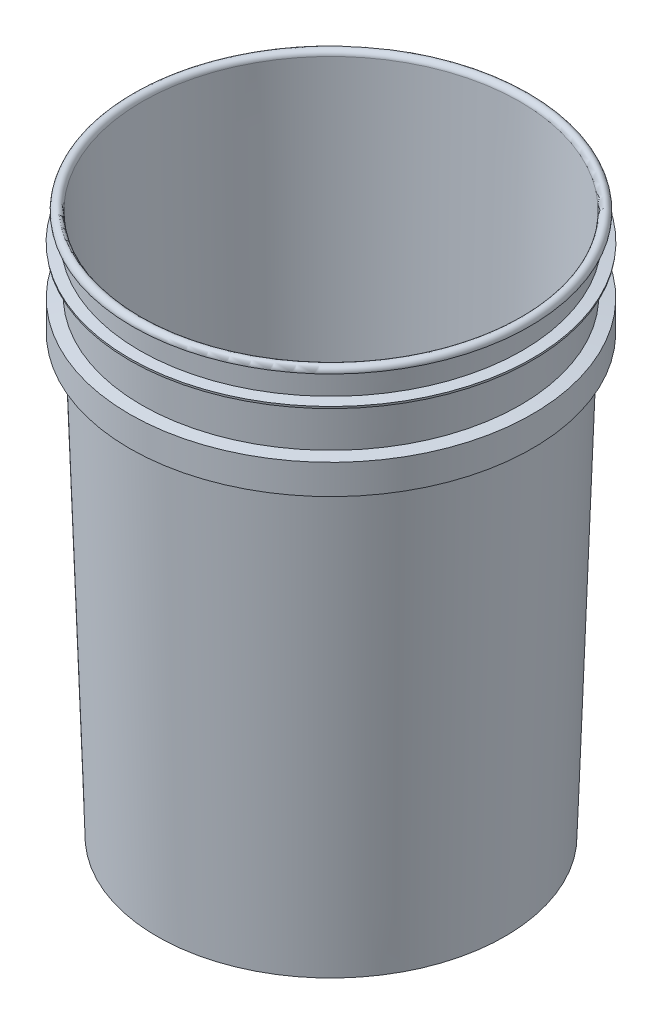
ISO-10303-21;
HEADER;
FILE_DESCRIPTION(('STEP AP214'),'2;1');
FILE_NAME('part.step','',(''),(''),'','','');
FILE_SCHEMA(('AUTOMOTIVE_DESIGN { 1 0 10303 214 1 1 1 1 }'));
ENDSEC;
DATA;
#1=APPLICATION_CONTEXT('core data for automotive mechanical design processes');
#2=APPLICATION_PROTOCOL_DEFINITION('international standard','automotive_design',2000,#1);
#3=PRODUCT_CONTEXT('',#1,'mechanical');
#4=PRODUCT('Part','Part','',(#3));
#5=PRODUCT_RELATED_PRODUCT_CATEGORY('part','',(#4));
#6=PRODUCT_DEFINITION_FORMATION('','',#4);
#7=PRODUCT_DEFINITION_CONTEXT('part definition',#1,'design');
#8=PRODUCT_DEFINITION('design','',#6,#7);
#9=PRODUCT_DEFINITION_SHAPE('','',#8);
#10=(LENGTH_UNIT() NAMED_UNIT(*) SI_UNIT(.MILLI.,.METRE.));
#11=(NAMED_UNIT(*) PLANE_ANGLE_UNIT() SI_UNIT($,.RADIAN.));
#12=(NAMED_UNIT(*) SI_UNIT($,.STERADIAN.) SOLID_ANGLE_UNIT());
#13=UNCERTAINTY_MEASURE_WITH_UNIT(LENGTH_MEASURE(1.E-05),#10,'distance_accuracy_value','');
#14=(GEOMETRIC_REPRESENTATION_CONTEXT(3) GLOBAL_UNCERTAINTY_ASSIGNED_CONTEXT((#13)) GLOBAL_UNIT_ASSIGNED_CONTEXT((#10,
#11,#12)) REPRESENTATION_CONTEXT('',''));
#15=CARTESIAN_POINT('',(0.,0.,0.));
#16=DIRECTION('',(0.,0.,1.));
#17=DIRECTION('',(1.,0.,0.));
#18=AXIS2_PLACEMENT_3D('',#15,#16,#17);
#19=CARTESIAN_POINT('',(-1.98014054073562E-13,-188.609435937279,1.16663887432404E-13));
#20=DIRECTION('',(0.,1.,0.));
#21=DIRECTION('',(0.,0.,1.));
#22=AXIS2_PLACEMENT_3D('',#19,#20,#21);
#23=CONICAL_SURFACE('',#22,0.,1.56951116486731);
#24=CARTESIAN_POINT('',(-1.98014054073562E-13,-188.438089113427,1.16663887432404E-13));
#25=DIRECTION('',(0.,-1.,0.));
#26=DIRECTION('',(0.,0.,-1.));
#27=AXIS2_PLACEMENT_3D('',#24,#25,#26);
#28=CIRCLE('',#27,133.326957357955);
#29=CARTESIAN_POINT('',(-1.98014054073562E-13,-188.438089113427,-133.326957357955));
#30=VERTEX_POINT('',#29);
#31=EDGE_CURVE('E11',#30,#30,#28,.T.);
#32=ORIENTED_EDGE('',*,*,#31,.F.);
#33=EDGE_LOOP('',(#32));
#34=FACE_BOUND('',#33,.T.);
#35=CARTESIAN_POINT('',(-1.98014054073562E-13,-188.609435937279,1.16663887432404E-13));
#36=VERTEX_POINT('',#35);
#37=VERTEX_LOOP('',#36);
#38=FACE_BOUND('',#37,.T.);
#39=ADVANCED_FACE('F39',(#34,#38),#23,.F.);
#40=CARTESIAN_POINT('',(-1.98014054073562E-13,-188.438089113427,1.16663887432404E-13));
#41=DIRECTION('',(0.,1.,0.));
#42=DIRECTION('',(0.,0.,1.));
#43=AXIS2_PLACEMENT_3D('',#40,#41,#42);
#44=CONICAL_SURFACE('',#43,133.326957357955,0.0329276405183383);
#45=CARTESIAN_POINT('',(-1.98014054073562E-13,227.895295594445,1.16663887432404E-13));
#46=DIRECTION('',(0.,-1.,0.));
#47=DIRECTION('',(0.,0.,-1.));
#48=AXIS2_PLACEMENT_3D('',#45,#46,#47);
#49=CIRCLE('',#48,147.040790057725);
#50=CARTESIAN_POINT('',(-1.98014054073562E-13,227.895295594445,-147.040790057725));
#51=VERTEX_POINT('',#50);
#52=EDGE_CURVE('E46',#51,#51,#49,.T.);
#53=ORIENTED_EDGE('',*,*,#52,.F.);
#54=EDGE_LOOP('',(#53));
#55=FACE_BOUND('',#54,.T.);
#56=ORIENTED_EDGE('',*,*,#31,.T.);
#57=EDGE_LOOP('',(#56));
#58=FACE_BOUND('',#57,.T.);
#59=ADVANCED_FACE('F50',(#55,#58),#44,.F.);
#60=CARTESIAN_POINT('',(-1.98014054073562E-13,227.701133754347,1.16663887432404E-13));
#61=DIRECTION('',(0.,-1.,0.));
#62=DIRECTION('',(0.,0.,-1.));
#63=AXIS2_PLACEMENT_3D('',#60,#61,#62);
#64=TOROIDAL_SURFACE('',#63,150.799382201157,3.7636038209169);
#65=CARTESIAN_POINT('',(-1.98014054073562E-13,227.071244628431,1.16663887432404E-13));
#66=DIRECTION('',(0.,-1.,0.));
#67=DIRECTION('',(0.,0.,-1.));
#68=AXIS2_PLACEMENT_3D('',#65,#66,#67);
#69=CIRCLE('',#68,154.50990149229);
#70=CARTESIAN_POINT('',(-1.98014054073562E-13,227.071244628431,-154.50990149229));
#71=VERTEX_POINT('',#70);
#72=EDGE_CURVE('E225',#71,#71,#69,.T.);
#73=ORIENTED_EDGE('',*,*,#72,.F.);
#74=EDGE_LOOP('',(#73));
#75=FACE_BOUND('',#74,.T.);
#76=ORIENTED_EDGE('',*,*,#52,.T.);
#77=EDGE_LOOP('',(#76));
#78=FACE_BOUND('',#77,.T.);
#79=ADVANCED_FACE('F55',(#75,#78),#64,.T.);
#80=CARTESIAN_POINT('',(-153.499473546092,227.071244628431,1.16663887432404E-13));
#81=DIRECTION('',(0.,1.,0.));
#82=DIRECTION('',(0.,0.,1.));
#83=AXIS2_PLACEMENT_3D('',#80,#81,#82);
#84=PLANE('',#83);
#85=CARTESIAN_POINT('',(-1.98014054073562E-13,227.071244628431,1.16663887432404E-13));
#86=DIRECTION('',(0.,-1.,0.));
#87=DIRECTION('',(0.,0.,-1.));
#88=AXIS2_PLACEMENT_3D('',#85,#86,#87);
#89=CIRCLE('',#88,153.499473546092);
#90=CARTESIAN_POINT('',(-1.98014054073562E-13,227.071244628431,-153.499473546092));
#91=VERTEX_POINT('',#90);
#92=EDGE_CURVE('E221',#91,#91,#89,.T.);
#93=ORIENTED_EDGE('',*,*,#92,.F.);
#94=EDGE_LOOP('',(#93));
#95=FACE_BOUND('',#94,.T.);
#96=ORIENTED_EDGE('',*,*,#72,.T.);
#97=EDGE_LOOP('',(#96));
#98=FACE_BOUND('',#97,.T.);
#99=ADVANCED_FACE('F62',(#95,#98),#84,.F.);
#100=CARTESIAN_POINT('',(-1.98014054073562E-13,225.674191286947,1.16663887432404E-13));
#101=DIRECTION('',(0.,-1.,0.));
#102=DIRECTION('',(0.,0.,-1.));
#103=AXIS2_PLACEMENT_3D('',#100,#101,#102);
#104=TOROIDAL_SURFACE('',#103,151.12695393544,2.75329027563019);
#105=CARTESIAN_POINT('',(-1.98014054073562E-13,227.78507606032,1.16663887432404E-13));
#106=DIRECTION('',(0.,-1.,0.));
#107=DIRECTION('',(0.,0.,-1.));
#108=AXIS2_PLACEMENT_3D('',#105,#106,#107);
#109=CIRCLE('',#108,149.359251241143);
#110=CARTESIAN_POINT('',(-1.98014054073562E-13,227.78507606032,-149.359251241143));
#111=VERTEX_POINT('',#110);
#112=EDGE_CURVE('E217',#111,#111,#109,.T.);
#113=ORIENTED_EDGE('',*,*,#112,.F.);
#114=EDGE_LOOP('',(#113));
#115=FACE_BOUND('',#114,.T.);
#116=ORIENTED_EDGE('',*,*,#92,.T.);
#117=EDGE_LOOP('',(#116));
#118=FACE_BOUND('',#117,.T.);
#119=ADVANCED_FACE('F69',(#115,#118),#104,.F.);
#120=CARTESIAN_POINT('',(-1.98014054073562E-13,227.78507606032,1.16663887432404E-13));
#121=DIRECTION('',(0.,1.,0.));
#122=DIRECTION('',(0.,0.,1.));
#123=AXIS2_PLACEMENT_3D('',#120,#121,#122);
#124=CONICAL_SURFACE('',#123,149.359251241143,0.0284474394420142);
#125=CARTESIAN_POINT('',(-1.98014054073562E-13,207.986606855514,1.16663887432404E-13));
#126=DIRECTION('',(0.,-1.,0.));
#127=DIRECTION('',(0.,0.,-1.));
#128=AXIS2_PLACEMENT_3D('',#125,#126,#127);
#129=CIRCLE('',#128,148.795883509471);
#130=CARTESIAN_POINT('',(-1.98014054073562E-13,207.986606855514,-148.79588350947));
#131=VERTEX_POINT('',#130);
#132=EDGE_CURVE('E213',#131,#131,#129,.T.);
#133=ORIENTED_EDGE('',*,*,#132,.F.);
#134=EDGE_LOOP('',(#133));
#135=FACE_BOUND('',#134,.T.);
#136=ORIENTED_EDGE('',*,*,#112,.T.);
#137=EDGE_LOOP('',(#136));
#138=FACE_BOUND('',#137,.T.);
#139=ADVANCED_FACE('F73',(#135,#138),#124,.T.);
#140=CARTESIAN_POINT('',(-1.98014054073562E-13,207.986606855514,1.16663887432404E-13));
#141=DIRECTION('',(0.,-1.,0.));
#142=DIRECTION('',(0.,0.,-1.));
#143=AXIS2_PLACEMENT_3D('',#140,#141,#142);
#144=CONICAL_SURFACE('',#143,148.795883509471,1.4273644191189);
#145=CARTESIAN_POINT('',(-1.98014054073562E-13,206.828788599722,1.16663887432404E-13));
#146=DIRECTION('',(0.,-1.,0.));
#147=DIRECTION('',(0.,0.,-1.));
#148=AXIS2_PLACEMENT_3D('',#145,#146,#147);
#149=CIRCLE('',#148,156.812701684068);
#150=CARTESIAN_POINT('',(-1.98014054073562E-13,206.828788599722,-156.812701684068));
#151=VERTEX_POINT('',#150);
#152=EDGE_CURVE('E209',#151,#151,#149,.T.);
#153=ORIENTED_EDGE('',*,*,#152,.F.);
#154=EDGE_LOOP('',(#153));
#155=FACE_BOUND('',#154,.T.);
#156=ORIENTED_EDGE('',*,*,#132,.T.);
#157=EDGE_LOOP('',(#156));
#158=FACE_BOUND('',#157,.T.);
#159=ADVANCED_FACE('F77',(#155,#158),#144,.T.);
#160=CARTESIAN_POINT('',(-1.98014054073562E-13,206.828788599722,1.16663887432404E-13));
#161=DIRECTION('',(0.,1.,0.));
#162=DIRECTION('',(0.,0.,1.));
#163=AXIS2_PLACEMENT_3D('',#160,#161,#162);
#164=CONICAL_SURFACE('',#163,156.812701684068,0.143431907676002);
#165=CARTESIAN_POINT('',(-1.98014054073562E-13,205.204218967833,1.16663887432404E-13));
#166=DIRECTION('',(0.,-1.,0.));
#167=DIRECTION('',(0.,0.,-1.));
#168=AXIS2_PLACEMENT_3D('',#165,#166,#167);
#169=CIRCLE('',#168,156.578075385125);
#170=CARTESIAN_POINT('',(-1.98014054073562E-13,205.204218967833,-156.578075385125));
#171=VERTEX_POINT('',#170);
#172=EDGE_CURVE('E205',#171,#171,#169,.T.);
#173=ORIENTED_EDGE('',*,*,#172,.F.);
#174=EDGE_LOOP('',(#173));
#175=FACE_BOUND('',#174,.T.);
#176=ORIENTED_EDGE('',*,*,#152,.T.);
#177=EDGE_LOOP('',(#176));
#178=FACE_BOUND('',#177,.T.);
#179=ADVANCED_FACE('F81',(#175,#178),#164,.T.);
#180=CARTESIAN_POINT('',(-1.98014054073562E-13,205.204218967833,1.16663887432404E-13));
#181=DIRECTION('',(0.,-1.,0.));
#182=DIRECTION('',(0.,0.,-1.));
#183=AXIS2_PLACEMENT_3D('',#180,#181,#182);
#184=CONICAL_SURFACE('',#183,156.578075385125,1.4273644191189);
#185=CARTESIAN_POINT('',(-1.98014054073562E-13,206.36072928115,1.16663887432404E-13));
#186=DIRECTION('',(0.,-1.,0.));
#187=DIRECTION('',(0.,0.,-1.));
#188=AXIS2_PLACEMENT_3D('',#185,#186,#187);
#189=CIRCLE('',#188,148.570313499762);
#190=CARTESIAN_POINT('',(-1.98014054073562E-13,206.36072928115,-148.570313499762));
#191=VERTEX_POINT('',#190);
#192=EDGE_CURVE('E201',#191,#191,#189,.T.);
#193=ORIENTED_EDGE('',*,*,#192,.F.);
#194=EDGE_LOOP('',(#193));
#195=FACE_BOUND('',#194,.T.);
#196=ORIENTED_EDGE('',*,*,#172,.T.);
#197=EDGE_LOOP('',(#196));
#198=FACE_BOUND('',#197,.T.);
#199=ADVANCED_FACE('F85',(#195,#198),#184,.F.);
#200=CARTESIAN_POINT('',(-1.98014054073562E-13,206.36072928115,1.16663887432404E-13));
#201=DIRECTION('',(0.,1.,0.));
#202=DIRECTION('',(0.,0.,1.));
#203=AXIS2_PLACEMENT_3D('',#200,#201,#202);
#204=CONICAL_SURFACE('',#203,148.570313499762,0.0329276405183388);
#205=CARTESIAN_POINT('',(-1.98014054073562E-13,170.59873380968,1.16663887432404E-13));
#206=DIRECTION('',(0.,-1.,0.));
#207=DIRECTION('',(0.,0.,-1.));
#208=AXIS2_PLACEMENT_3D('',#205,#206,#207);
#209=CIRCLE('',#208,147.392329602915);
#210=CARTESIAN_POINT('',(-1.98014054073562E-13,170.59873380968,-147.392329602915));
#211=VERTEX_POINT('',#210);
#212=EDGE_CURVE('E197',#211,#211,#209,.T.);
#213=ORIENTED_EDGE('',*,*,#212,.F.);
#214=EDGE_LOOP('',(#213));
#215=FACE_BOUND('',#214,.T.);
#216=ORIENTED_EDGE('',*,*,#192,.T.);
#217=EDGE_LOOP('',(#216));
#218=FACE_BOUND('',#217,.T.);
#219=ADVANCED_FACE('F89',(#215,#218),#204,.T.);
#220=CARTESIAN_POINT('',(-1.98014054073562E-13,170.59873380968,1.16663887432404E-13));
#221=DIRECTION('',(0.,-1.,0.));
#222=DIRECTION('',(0.,0.,-1.));
#223=AXIS2_PLACEMENT_3D('',#220,#221,#222);
#224=CONICAL_SURFACE('',#223,147.392329602915,1.41195910306503);
#225=CARTESIAN_POINT('',(-1.98014054073562E-13,169.105655842024,1.16663887432404E-13));
#226=DIRECTION('',(0.,-1.,0.));
#227=DIRECTION('',(0.,0.,-1.));
#228=AXIS2_PLACEMENT_3D('',#225,#226,#227);
#229=CIRCLE('',#228,156.71319497381);
#230=CARTESIAN_POINT('',(-1.98014054073562E-13,169.105655842024,-156.71319497381));
#231=VERTEX_POINT('',#230);
#232=EDGE_CURVE('E193',#231,#231,#229,.T.);
#233=ORIENTED_EDGE('',*,*,#232,.F.);
#234=EDGE_LOOP('',(#233));
#235=FACE_BOUND('',#234,.T.);
#236=ORIENTED_EDGE('',*,*,#212,.T.);
#237=EDGE_LOOP('',(#236));
#238=FACE_BOUND('',#237,.T.);
#239=ADVANCED_FACE('F93',(#235,#238),#224,.T.);
#240=CARTESIAN_POINT('',(-1.98014054073562E-13,-188.609435937279,1.16663887432404E-13));
#241=DIRECTION('',(0.,-1.,0.));
#242=DIRECTION('',(0.,0.,-1.));
#243=AXIS2_PLACEMENT_3D('',#240,#241,#242);
#244=CYLINDRICAL_SURFACE('',#243,156.713194973811);
#245=CARTESIAN_POINT('',(-1.98014054073562E-13,145.987696884564,1.16663887432404E-13));
#246=DIRECTION('',(0.,-1.,0.));
#247=DIRECTION('',(0.,0.,-1.));
#248=AXIS2_PLACEMENT_3D('',#245,#246,#247);
#249=CIRCLE('',#248,156.713194973811);
#250=CARTESIAN_POINT('',(-1.98014054073562E-13,145.987696884564,-156.713194973811));
#251=VERTEX_POINT('',#250);
#252=EDGE_CURVE('E189',#251,#251,#249,.T.);
#253=ORIENTED_EDGE('',*,*,#252,.F.);
#254=EDGE_LOOP('',(#253));
#255=FACE_BOUND('',#254,.T.);
#256=ORIENTED_EDGE('',*,*,#232,.T.);
#257=EDGE_LOOP('',(#256));
#258=FACE_BOUND('',#257,.T.);
#259=ADVANCED_FACE('F97',(#255,#258),#244,.T.);
#260=CARTESIAN_POINT('',(-154.930227057679,145.987696884564,1.16663887432404E-13));
#261=DIRECTION('',(0.,1.,0.));
#262=DIRECTION('',(0.,0.,1.));
#263=AXIS2_PLACEMENT_3D('',#260,#261,#262);
#264=PLANE('',#263);
#265=CARTESIAN_POINT('',(-1.98014054073562E-13,145.987696884564,1.16663887432404E-13));
#266=DIRECTION('',(0.,-1.,0.));
#267=DIRECTION('',(0.,0.,-1.));
#268=AXIS2_PLACEMENT_3D('',#265,#266,#267);
#269=CIRCLE('',#268,154.930227057679);
#270=CARTESIAN_POINT('',(-1.98014054073562E-13,145.987696884564,-154.930227057679));
#271=VERTEX_POINT('',#270);
#272=EDGE_CURVE('E185',#271,#271,#269,.T.);
#273=ORIENTED_EDGE('',*,*,#272,.F.);
#274=EDGE_LOOP('',(#273));
#275=FACE_BOUND('',#274,.T.);
#276=ORIENTED_EDGE('',*,*,#252,.T.);
#277=EDGE_LOOP('',(#276));
#278=FACE_BOUND('',#277,.T.);
#279=ADVANCED_FACE('F101',(#275,#278),#264,.F.);
#280=CARTESIAN_POINT('',(-1.98014054073562E-13,-188.609435937279,1.16663887432404E-13));
#281=DIRECTION('',(0.,-1.,0.));
#282=DIRECTION('',(0.,0.,-1.));
#283=AXIS2_PLACEMENT_3D('',#280,#281,#282);
#284=CYLINDRICAL_SURFACE('',#283,154.930227057679);
#285=CARTESIAN_POINT('',(-1.98014054073562E-13,167.613523694171,1.16663887432404E-13));
#286=DIRECTION('',(0.,-1.,0.));
#287=DIRECTION('',(0.,0.,-1.));
#288=AXIS2_PLACEMENT_3D('',#285,#286,#287);
#289=CIRCLE('',#288,154.930227057679);
#290=CARTESIAN_POINT('',(-1.98014054073562E-13,167.613523694171,-154.930227057679));
#291=VERTEX_POINT('',#290);
#292=EDGE_CURVE('E181',#291,#291,#289,.T.);
#293=ORIENTED_EDGE('',*,*,#292,.F.);
#294=EDGE_LOOP('',(#293));
#295=FACE_BOUND('',#294,.T.);
#296=ORIENTED_EDGE('',*,*,#272,.T.);
#297=EDGE_LOOP('',(#296));
#298=FACE_BOUND('',#297,.T.);
#299=ADVANCED_FACE('F105',(#295,#298),#284,.F.);
#300=CARTESIAN_POINT('',(-1.98014054073562E-13,167.613523694171,1.16663887432404E-13));
#301=DIRECTION('',(0.,-1.,0.));
#302=DIRECTION('',(0.,0.,-1.));
#303=AXIS2_PLACEMENT_3D('',#300,#301,#302);
#304=CONICAL_SURFACE('',#303,154.930227057679,1.41195910306503);
#305=CARTESIAN_POINT('',(-1.98014054073562E-13,168.830325012819,1.16663887432404E-13));
#306=DIRECTION('',(0.,-1.,0.));
#307=DIRECTION('',(0.,0.,-1.));
#308=AXIS2_PLACEMENT_3D('',#305,#306,#307);
#309=CIRCLE('',#308,147.334079019907);
#310=CARTESIAN_POINT('',(-1.98014054073562E-13,168.830325012819,-147.334079019907));
#311=VERTEX_POINT('',#310);
#312=EDGE_CURVE('E177',#311,#311,#309,.T.);
#313=ORIENTED_EDGE('',*,*,#312,.F.);
#314=EDGE_LOOP('',(#313));
#315=FACE_BOUND('',#314,.T.);
#316=ORIENTED_EDGE('',*,*,#292,.T.);
#317=EDGE_LOOP('',(#316));
#318=FACE_BOUND('',#317,.T.);
#319=ADVANCED_FACE('F109',(#315,#318),#304,.F.);
#320=CARTESIAN_POINT('',(-1.98014054073562E-13,168.830325012819,1.16663887432404E-13));
#321=DIRECTION('',(0.,1.,0.));
#322=DIRECTION('',(0.,0.,1.));
#323=AXIS2_PLACEMENT_3D('',#320,#321,#322);
#324=CONICAL_SURFACE('',#323,147.334079019907,0.0329276405183383);
#325=CARTESIAN_POINT('',(-1.98014054073562E-13,-193.562910654545,1.16663887432404E-13));
#326=DIRECTION('',(0.,-1.,0.));
#327=DIRECTION('',(0.,0.,-1.));
#328=AXIS2_PLACEMENT_3D('',#325,#326,#327);
#329=CIRCLE('',#328,135.397010343664);
#330=CARTESIAN_POINT('',(-1.98014054073562E-13,-193.562910654545,-135.397010343664));
#331=VERTEX_POINT('',#330);
#332=EDGE_CURVE('E173',#331,#331,#329,.T.);
#333=ORIENTED_EDGE('',*,*,#332,.F.);
#334=EDGE_LOOP('',(#333));
#335=FACE_BOUND('',#334,.T.);
#336=ORIENTED_EDGE('',*,*,#312,.T.);
#337=EDGE_LOOP('',(#336));
#338=FACE_BOUND('',#337,.T.);
#339=ADVANCED_FACE('F113',(#335,#338),#324,.T.);
#340=CARTESIAN_POINT('',(-133.246654690193,-193.562910654545,1.16663887432404E-13));
#341=DIRECTION('',(0.,1.,0.));
#342=DIRECTION('',(0.,0.,1.));
#343=AXIS2_PLACEMENT_3D('',#340,#341,#342);
#344=PLANE('',#343);
#345=CARTESIAN_POINT('',(-1.98014054073562E-13,-193.562910654545,1.16663887432404E-13));
#346=DIRECTION('',(0.,-1.,0.));
#347=DIRECTION('',(0.,0.,-1.));
#348=AXIS2_PLACEMENT_3D('',#345,#346,#347);
#349=CIRCLE('',#348,133.246654690193);
#350=CARTESIAN_POINT('',(-1.98014054073562E-13,-193.562910654545,-133.246654690193));
#351=VERTEX_POINT('',#350);
#352=EDGE_CURVE('E169',#351,#351,#349,.T.);
#353=ORIENTED_EDGE('',*,*,#352,.F.);
#354=EDGE_LOOP('',(#353));
#355=FACE_BOUND('',#354,.T.);
#356=ORIENTED_EDGE('',*,*,#332,.T.);
#357=EDGE_LOOP('',(#356));
#358=FACE_BOUND('',#357,.T.);
#359=ADVANCED_FACE('F117',(#355,#358),#344,.F.);
#360=CARTESIAN_POINT('',(-1.98014054073562E-13,-188.609435937279,1.16663887432404E-13));
#361=DIRECTION('',(0.,-1.,0.));
#362=DIRECTION('',(0.,0.,-1.));
#363=AXIS2_PLACEMENT_3D('',#360,#361,#362);
#364=CYLINDRICAL_SURFACE('',#363,133.246654690193);
#365=CARTESIAN_POINT('',(-1.98014054073562E-13,-190.791102938963,1.16663887432404E-13));
#366=DIRECTION('',(0.,-1.,0.));
#367=DIRECTION('',(0.,0.,-1.));
#368=AXIS2_PLACEMENT_3D('',#365,#366,#367);
#369=CIRCLE('',#368,133.246654690193);
#370=CARTESIAN_POINT('',(-1.98014054073562E-13,-190.791102938963,133.246654690203));
#371=VERTEX_POINT('',#370);
#372=EDGE_CURVE('E165',#371,#371,#369,.T.);
#373=ORIENTED_EDGE('',*,*,#372,.F.);
#374=EDGE_LOOP('',(#373));
#375=FACE_BOUND('',#374,.T.);
#376=ORIENTED_EDGE('',*,*,#352,.T.);
#377=EDGE_LOOP('',(#376));
#378=FACE_BOUND('',#377,.T.);
#379=ADVANCED_FACE('F121',(#375,#378),#364,.F.);
#380=CARTESIAN_POINT('',(-1.98014054073562E-13,-190.791102938963,1.16663887432404E-13));
#381=DIRECTION('',(0.,1.,0.));
#382=DIRECTION('',(0.,0.,1.));
#383=AXIS2_PLACEMENT_3D('',#380,#381,#382);
#384=CONICAL_SURFACE('',#383,133.246654690193,1.56941496564699);
#385=CARTESIAN_POINT('',(-1.98014054073562E-13,-190.936343157959,1.16663887432404E-13));
#386=DIRECTION('',(0.,-1.,0.));
#387=DIRECTION('',(0.,0.,-1.));
#388=AXIS2_PLACEMENT_3D('',#385,#386,#387);
#389=CIRCLE('',#388,28.1038925419442);
#390=CARTESIAN_POINT('',(-1.98014054073562E-13,-190.936343157959,28.1038925419443));
#391=VERTEX_POINT('',#390);
#392=EDGE_CURVE('E161',#391,#391,#389,.T.);
#393=CARTESIAN_POINT('',(-1.98014054073562E-13,-190.936343157959,28.1038925419443));
#394=CARTESIAN_POINT('',(-1.98014054073562E-13,-190.934830239012,29.1991296476553));
#395=CARTESIAN_POINT('',(-1.98014054073562E-13,-190.933317320064,30.2943667533664));
#396=CARTESIAN_POINT('',(-1.98014054073562E-13,-190.930291482168,32.4848409647884));
#397=CARTESIAN_POINT('',(-1.98014054073562E-13,-190.92877856322,33.5800780704995));
#398=CARTESIAN_POINT('',(-1.98014054073562E-13,-190.925752725324,35.7705522819215));
#399=CARTESIAN_POINT('',(-1.98014054073562E-13,-190.924239806376,36.8657893876325));
#400=CARTESIAN_POINT('',(-1.98014054073562E-13,-190.921213968481,39.0562635990546));
#401=CARTESIAN_POINT('',(-1.98014054073562E-13,-190.919701049533,40.1515007047656));
#402=CARTESIAN_POINT('',(-1.98014054073562E-13,-190.916675211637,42.3419749161877));
#403=CARTESIAN_POINT('',(-1.98014054073562E-13,-190.915162292689,43.4372120218988));
#404=CARTESIAN_POINT('',(-1.98014054073562E-13,-190.912136454793,45.6276862333208));
#405=CARTESIAN_POINT('',(-1.98014054073562E-13,-190.910623535846,46.7229233390318));
#406=CARTESIAN_POINT('',(-1.98014054073562E-13,-190.90759769795,48.9133975504539));
#407=CARTESIAN_POINT('',(-1.98014054073562E-13,-190.906084779002,50.0086346561649));
#408=CARTESIAN_POINT('',(-1.98014054073562E-13,-190.903058941106,52.199108867587));
#409=CARTESIAN_POINT('',(-1.98014054073562E-13,-190.901546022158,53.294345973298));
#410=CARTESIAN_POINT('',(-1.98014054073562E-13,-190.898520184263,55.4848201847201));
#411=CARTESIAN_POINT('',(-1.98014054073562E-13,-190.897007265315,56.5800572904311));
#412=CARTESIAN_POINT('',(-1.98014054073562E-13,-190.893981427419,58.7705315018532));
#413=CARTESIAN_POINT('',(-1.98014054073562E-13,-190.892468508471,59.8657686075642));
#414=CARTESIAN_POINT('',(-1.98014054073562E-13,-190.889442670575,62.0562428189863));
#415=CARTESIAN_POINT('',(-1.98014054073562E-13,-190.887929751627,63.1514799246973));
#416=CARTESIAN_POINT('',(-1.98014054073562E-13,-190.884903913732,65.3419541361194));
#417=CARTESIAN_POINT('',(-1.98014054073562E-13,-190.883390994784,66.4371912418304));
#418=CARTESIAN_POINT('',(-1.98014054073562E-13,-190.880365156888,68.6276654532525));
#419=CARTESIAN_POINT('',(-1.98014054073562E-13,-190.87885223794,69.7229025589635));
#420=CARTESIAN_POINT('',(-1.98014054073562E-13,-190.875826400044,71.9133767703856));
#421=CARTESIAN_POINT('',(-1.98014054073562E-13,-190.874313481097,73.0086138760966));
#422=CARTESIAN_POINT('',(-1.98014054073562E-13,-190.871287643201,75.1990880875187));
#423=CARTESIAN_POINT('',(-1.98014054073562E-13,-190.869774724253,76.2943251932297));
#424=CARTESIAN_POINT('',(-1.98014054073562E-13,-190.866748886357,78.4847994046518));
#425=CARTESIAN_POINT('',(-1.98014054073562E-13,-190.865235967409,79.5800365103628));
#426=CARTESIAN_POINT('',(-1.98014054073562E-13,-190.862210129514,81.7705107217849));
#427=CARTESIAN_POINT('',(-1.98014054073562E-13,-190.860697210566,82.8657478274959));
#428=CARTESIAN_POINT('',(-1.98014054073562E-13,-190.85767137267,85.056222038918));
#429=CARTESIAN_POINT('',(-1.98014054073562E-13,-190.856158453722,86.151459144629));
#430=CARTESIAN_POINT('',(-1.98014054073562E-13,-190.853132615826,88.341933356051));
#431=CARTESIAN_POINT('',(-1.98014054073562E-13,-190.851619696878,89.4371704617621));
#432=CARTESIAN_POINT('',(-1.98014054073562E-13,-190.848593858983,91.6276446731841));
#433=CARTESIAN_POINT('',(-1.98014054073562E-13,-190.847080940035,92.7228817788952));
#434=CARTESIAN_POINT('',(-1.98014054073562E-13,-190.844055102139,94.9133559903172));
#435=CARTESIAN_POINT('',(-1.98014054073562E-13,-190.842542183191,96.0085930960283));
#436=CARTESIAN_POINT('',(-1.98014054073562E-13,-190.839516345295,98.1990673074503));
#437=CARTESIAN_POINT('',(-1.98014054073562E-13,-190.838003426348,99.2943044131614));
#438=CARTESIAN_POINT('',(-1.98014054073562E-13,-190.834977588452,101.484778624583));
#439=CARTESIAN_POINT('',(-1.98014054073562E-13,-190.833464669504,102.580015730294));
#440=CARTESIAN_POINT('',(-1.98014054073562E-13,-190.830438831608,104.770489941717));
#441=CARTESIAN_POINT('',(-1.98014054073562E-13,-190.82892591266,105.865727047428));
#442=CARTESIAN_POINT('',(-1.98014054073562E-13,-190.825900074765,108.05620125885));
#443=CARTESIAN_POINT('',(-1.98014054073562E-13,-190.824387155817,109.151438364561));
#444=CARTESIAN_POINT('',(-1.98014054073562E-13,-190.821361317921,111.341912575983));
#445=CARTESIAN_POINT('',(-1.98014054073562E-13,-190.819848398973,112.437149681694));
#446=CARTESIAN_POINT('',(-1.98014054073562E-13,-190.816822561077,114.627623893116));
#447=CARTESIAN_POINT('',(-1.98014054073562E-13,-190.815309642129,115.722860998827));
#448=CARTESIAN_POINT('',(-1.98014054073562E-13,-190.812283804234,117.913335210249));
#449=CARTESIAN_POINT('',(-1.98014054073562E-13,-190.810770885286,119.00857231596));
#450=CARTESIAN_POINT('',(-1.98014054073562E-13,-190.80774504739,121.199046527382));
#451=CARTESIAN_POINT('',(-1.98014054073562E-13,-190.806232128442,122.294283633093));
#452=CARTESIAN_POINT('',(-1.98014054073562E-13,-190.803206290546,124.484757844515));
#453=CARTESIAN_POINT('',(-1.98014054073562E-13,-190.801693371599,125.579994950226));
#454=CARTESIAN_POINT('',(-1.98014054073562E-13,-190.798667533703,127.770469161648));
#455=CARTESIAN_POINT('',(-1.98014054073562E-13,-190.797154614755,128.865706267359));
#456=CARTESIAN_POINT('',(-1.98014054073562E-13,-190.794128776859,131.056180478781));
#457=CARTESIAN_POINT('',(-1.98014054073562E-13,-190.792615857911,132.151417584492));
#458=CARTESIAN_POINT('',(-1.98014054073562E-13,-190.791102938963,133.246654690203));
#459=B_SPLINE_CURVE_WITH_KNOTS('',3,(#393,#394,#395,#396,#397,#398,#399,#400,#401,#402,#403,
#404,#405,#406,#407,#408,#409,#410,#411,#412,#413,#414,#415,#416,#417,#418,#419,#420,#421,#422,
#423,#424,#425,#426,#427,#428,#429,#430,#431,#432,#433,#434,#435,#436,#437,#438,#439,#440,#441,
#442,#443,#444,#445,#446,#447,#448,#449,#450,#451,#452,#453,#454,#455,#456,#457,#458),
.UNSPECIFIED.,.F.,.F.,(4,2,2,2,2,2,2,2,2,2,2,2,2,2,2,2,2,2,2,2,2,2,2,2,2,2,2,2,2,2,2,2,4),(0.,
3.28571445196477,6.57142890392955,9.85714335589432,13.1428578078591,16.4285722598239,
19.7142867117887,23.0000011637534,26.2857156157182,29.571430067683,32.8571445196478,
36.1428589716125,39.4285734235773,42.7142878755421,46.0000023275069,49.2857167794716,
52.5714312314364,55.8571456834012,59.1428601353659,62.4285745873307,65.7142890392955,
69.0000034912603,72.2857179432251,75.5714323951898,78.8571468471546,82.1428612991194,
85.4285757510842,88.714290203049,92.0000046550138,95.2857191069785,98.5714335589433,
101.857148010908,105.142862462873),.UNSPECIFIED.);
#460=EDGE_CURVE('BSEAM125',#391,#371,#459,.T.);
#461=ORIENTED_EDGE('',*,*,#392,.F.);
#462=ORIENTED_EDGE('',*,*,#372,.T.);
#463=ORIENTED_EDGE('',*,*,#460,.T.);
#464=ORIENTED_EDGE('',*,*,#460,.F.);
#465=EDGE_LOOP('',(#461,#463,#462,#464));
#466=FACE_BOUND('',#465,.T.);
#467=ADVANCED_FACE('F125',(#466),#384,.T.);
#468=CARTESIAN_POINT('',(-1.98014054073562E-13,-188.609435937279,1.16663887432404E-13));
#469=DIRECTION('',(0.,-1.,0.));
#470=DIRECTION('',(0.,0.,-1.));
#471=AXIS2_PLACEMENT_3D('',#468,#469,#470);
#472=CYLINDRICAL_SURFACE('',#471,28.1038925419442);
#473=CARTESIAN_POINT('',(-1.98014054073562E-13,-193.562910654545,1.16663887432404E-13));
#474=DIRECTION('',(0.,-1.,0.));
#475=DIRECTION('',(0.,0.,-1.));
#476=AXIS2_PLACEMENT_3D('',#473,#474,#475);
#477=CIRCLE('',#476,28.1038925419442);
#478=CARTESIAN_POINT('',(-1.98014054073562E-13,-193.562910654545,-28.1038925419441));
#479=VERTEX_POINT('',#478);
#480=EDGE_CURVE('E155',#479,#479,#477,.T.);
#481=ORIENTED_EDGE('',*,*,#480,.F.);
#482=EDGE_LOOP('',(#481));
#483=FACE_BOUND('',#482,.T.);
#484=ORIENTED_EDGE('',*,*,#392,.T.);
#485=EDGE_LOOP('',(#484));
#486=FACE_BOUND('',#485,.T.);
#487=ADVANCED_FACE('F129',(#483,#486),#472,.T.);
#488=CARTESIAN_POINT('',(-26.2069271277438,-193.562910654545,1.16663887432404E-13));
#489=DIRECTION('',(0.,1.,0.));
#490=DIRECTION('',(0.,0.,1.));
#491=AXIS2_PLACEMENT_3D('',#488,#489,#490);
#492=PLANE('',#491);
#493=CARTESIAN_POINT('',(-1.98014054073562E-13,-193.562910654545,1.16663887432404E-13));
#494=DIRECTION('',(0.,-1.,0.));
#495=DIRECTION('',(0.,0.,-1.));
#496=AXIS2_PLACEMENT_3D('',#493,#494,#495);
#497=CIRCLE('',#496,26.2069271277436);
#498=CARTESIAN_POINT('',(-1.98014054073562E-13,-193.562910654545,-26.2069271277435));
#499=VERTEX_POINT('',#498);
#500=EDGE_CURVE('E151',#499,#499,#497,.T.);
#501=ORIENTED_EDGE('',*,*,#500,.F.);
#502=EDGE_LOOP('',(#501));
#503=FACE_BOUND('',#502,.T.);
#504=ORIENTED_EDGE('',*,*,#480,.T.);
#505=EDGE_LOOP('',(#504));
#506=FACE_BOUND('',#505,.T.);
#507=ADVANCED_FACE('F133',(#503,#506),#492,.F.);
#508=CARTESIAN_POINT('',(-1.98014054073562E-13,-188.609435937279,1.16663887432404E-13));
#509=DIRECTION('',(0.,-1.,0.));
#510=DIRECTION('',(0.,0.,-1.));
#511=AXIS2_PLACEMENT_3D('',#508,#509,#510);
#512=CYLINDRICAL_SURFACE('',#511,26.2069271277436);
#513=CARTESIAN_POINT('',(-1.98014054073562E-13,-190.936343157959,1.16663887432404E-13));
#514=DIRECTION('',(0.,-1.,0.));
#515=DIRECTION('',(0.,0.,-1.));
#516=AXIS2_PLACEMENT_3D('',#513,#514,#515);
#517=CIRCLE('',#516,26.2069271277436);
#518=CARTESIAN_POINT('',(-1.98014054073562E-13,-190.936343157959,-26.2069271277435));
#519=VERTEX_POINT('',#518);
#520=EDGE_CURVE('E149',#519,#519,#517,.T.);
#521=ORIENTED_EDGE('',*,*,#520,.F.);
#522=EDGE_LOOP('',(#521));
#523=FACE_BOUND('',#522,.T.);
#524=ORIENTED_EDGE('',*,*,#500,.T.);
#525=EDGE_LOOP('',(#524));
#526=FACE_BOUND('',#525,.T.);
#527=ADVANCED_FACE('F137',(#523,#526),#512,.F.);
#528=CARTESIAN_POINT('',(-1.98014054073562E-13,-190.936343157959,1.16663887432404E-13));
#529=DIRECTION('',(0.,1.,0.));
#530=DIRECTION('',(0.,0.,1.));
#531=AXIS2_PLACEMENT_3D('',#528,#529,#530);
#532=PLANE('',#531);
#533=ORIENTED_EDGE('',*,*,#520,.T.);
#534=EDGE_LOOP('',(#533));
#535=FACE_BOUND('',#534,.T.);
#536=ADVANCED_FACE('F141',(#535),#532,.F.);
#537=CLOSED_SHELL('',(#39,#59,#79,#99,#119,#139,#159,#179,#199,#219,#239,#259,#279,#299,#319,
#339,#359,#379,#467,#487,#507,#527,#536));
#538=MANIFOLD_SOLID_BREP('B2',#537);
#539=ADVANCED_BREP_SHAPE_REPRESENTATION('',(#18,#538),#14);
#540=SHAPE_DEFINITION_REPRESENTATION(#9,#539);
ENDSEC;
END-ISO-10303-21;
